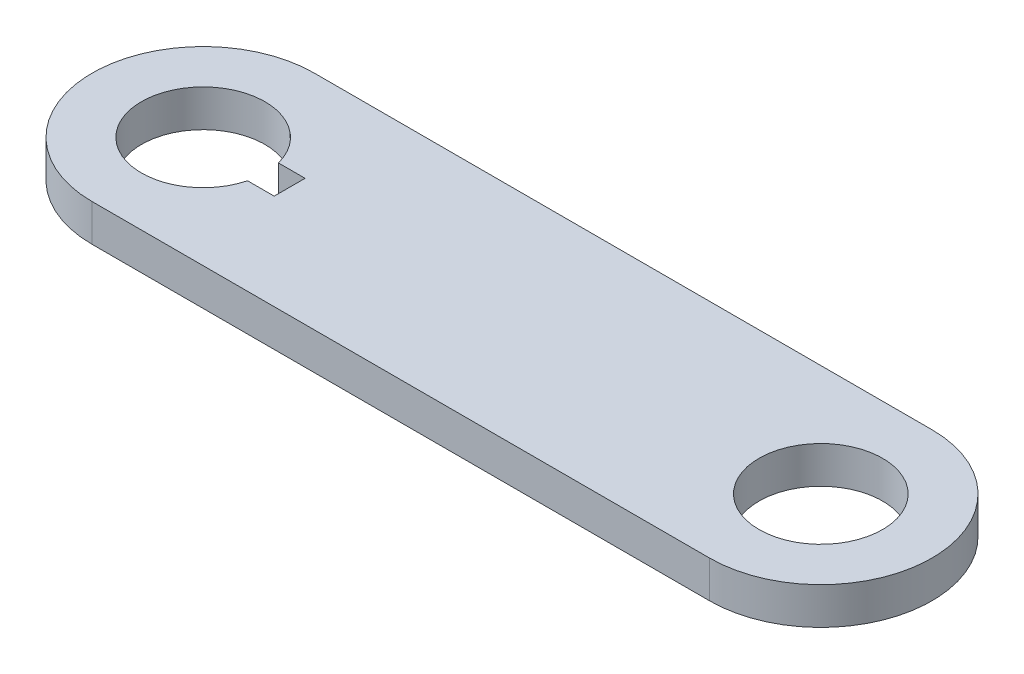
ISO-10303-21;
HEADER;
FILE_DESCRIPTION(('STEP AP214'),'2;1');
FILE_NAME('part.step','',(''),(''),'','','');
FILE_SCHEMA(('AUTOMOTIVE_DESIGN { 1 0 10303 214 1 1 1 1 }'));
ENDSEC;
DATA;
#1=APPLICATION_CONTEXT('core data for automotive mechanical design processes');
#2=APPLICATION_PROTOCOL_DEFINITION('international standard','automotive_design',2000,#1);
#3=PRODUCT_CONTEXT('',#1,'mechanical');
#4=PRODUCT('Part','Part','',(#3));
#5=PRODUCT_RELATED_PRODUCT_CATEGORY('part','',(#4));
#6=PRODUCT_DEFINITION_FORMATION('','',#4);
#7=PRODUCT_DEFINITION_CONTEXT('part definition',#1,'design');
#8=PRODUCT_DEFINITION('design','',#6,#7);
#9=PRODUCT_DEFINITION_SHAPE('','',#8);
#10=(LENGTH_UNIT() NAMED_UNIT(*) SI_UNIT(.MILLI.,.METRE.));
#11=(NAMED_UNIT(*) PLANE_ANGLE_UNIT() SI_UNIT($,.RADIAN.));
#12=(NAMED_UNIT(*) SI_UNIT($,.STERADIAN.) SOLID_ANGLE_UNIT());
#13=UNCERTAINTY_MEASURE_WITH_UNIT(LENGTH_MEASURE(1.E-05),#10,'distance_accuracy_value','');
#14=(GEOMETRIC_REPRESENTATION_CONTEXT(3) GLOBAL_UNCERTAINTY_ASSIGNED_CONTEXT((#13)) GLOBAL_UNIT_ASSIGNED_CONTEXT((#10,
#11,#12)) REPRESENTATION_CONTEXT('',''));
#15=CARTESIAN_POINT('',(0.,0.,0.));
#16=DIRECTION('',(0.,0.,1.));
#17=DIRECTION('',(1.,0.,0.));
#18=AXIS2_PLACEMENT_3D('',#15,#16,#17);
#19=CARTESIAN_POINT('',(0.,1.5,9.));
#20=DIRECTION('',(0.,0.,-1.));
#21=DIRECTION('',(-1.,0.,0.));
#22=AXIS2_PLACEMENT_3D('',#19,#20,#21);
#23=PLANE('',#22);
#24=DIRECTION('',(1.,0.,0.));
#25=VECTOR('',#24,1.);
#26=CARTESIAN_POINT('',(0.,-1.5,9.));
#27=LINE('',#26,#25);
#28=CARTESIAN_POINT('',(0.,-1.5,9.));
#29=VERTEX_POINT('',#28);
#30=CARTESIAN_POINT('',(50.,-1.5,9.));
#31=VERTEX_POINT('',#30);
#32=EDGE_CURVE('E166',#29,#31,#27,.T.);
#33=ORIENTED_EDGE('',*,*,#32,.T.);
#34=DIRECTION('',(0.,-1.,0.));
#35=VECTOR('',#34,1.);
#36=CARTESIAN_POINT('',(50.,1.5,9.));
#37=LINE('',#36,#35);
#38=CARTESIAN_POINT('',(50.,1.5,9.));
#39=VERTEX_POINT('',#38);
#40=EDGE_CURVE('E11',#39,#31,#37,.T.);
#41=ORIENTED_EDGE('',*,*,#40,.F.);
#42=DIRECTION('',(1.,0.,0.));
#43=VECTOR('',#42,1.);
#44=CARTESIAN_POINT('',(0.,1.5,9.));
#45=LINE('',#44,#43);
#46=CARTESIAN_POINT('',(0.,1.5,9.));
#47=VERTEX_POINT('',#46);
#48=EDGE_CURVE('E125',#47,#39,#45,.T.);
#49=ORIENTED_EDGE('',*,*,#48,.F.);
#50=DIRECTION('',(0.,-1.,0.));
#51=VECTOR('',#50,1.);
#52=CARTESIAN_POINT('',(0.,1.5,9.));
#53=LINE('',#52,#51);
#54=EDGE_CURVE('E178',#47,#29,#53,.T.);
#55=ORIENTED_EDGE('',*,*,#54,.T.);
#56=EDGE_LOOP('',(#33,#41,#49,#55));
#57=FACE_BOUND('',#56,.T.);
#58=ADVANCED_FACE('F47',(#57),#23,.F.);
#59=CARTESIAN_POINT('',(50.,1.5,0.));
#60=DIRECTION('',(0.,-1.,0.));
#61=DIRECTION('',(0.,0.,-1.));
#62=AXIS2_PLACEMENT_3D('',#59,#60,#61);
#63=CYLINDRICAL_SURFACE('',#62,9.);
#64=CARTESIAN_POINT('',(50.,-1.5,0.));
#65=DIRECTION('',(0.,1.,0.));
#66=DIRECTION('',(0.,0.,1.));
#67=AXIS2_PLACEMENT_3D('',#64,#65,#66);
#68=CIRCLE('',#67,9.);
#69=CARTESIAN_POINT('',(50.,-1.5,-9.));
#70=VERTEX_POINT('',#69);
#71=EDGE_CURVE('E132',#31,#70,#68,.T.);
#72=ORIENTED_EDGE('',*,*,#71,.T.);
#73=DIRECTION('',(0.,-1.,0.));
#74=VECTOR('',#73,1.);
#75=CARTESIAN_POINT('',(50.,1.5,-9.));
#76=LINE('',#75,#74);
#77=CARTESIAN_POINT('',(50.,1.5,-9.));
#78=VERTEX_POINT('',#77);
#79=EDGE_CURVE('E58',#78,#70,#76,.T.);
#80=ORIENTED_EDGE('',*,*,#79,.F.);
#81=CARTESIAN_POINT('',(50.,1.5,0.));
#82=DIRECTION('',(0.,1.,0.));
#83=DIRECTION('',(0.,0.,1.));
#84=AXIS2_PLACEMENT_3D('',#81,#82,#83);
#85=CIRCLE('',#84,9.);
#86=EDGE_CURVE('E119',#39,#78,#85,.T.);
#87=ORIENTED_EDGE('',*,*,#86,.F.);
#88=ORIENTED_EDGE('',*,*,#40,.T.);
#89=EDGE_LOOP('',(#72,#80,#87,#88));
#90=FACE_BOUND('',#89,.T.);
#91=ADVANCED_FACE('F131',(#90),#63,.T.);
#92=CARTESIAN_POINT('',(0.,1.5,-9.));
#93=DIRECTION('',(0.,0.,-1.));
#94=DIRECTION('',(-1.,0.,0.));
#95=AXIS2_PLACEMENT_3D('',#92,#93,#94);
#96=PLANE('',#95);
#97=DIRECTION('',(1.,0.,0.));
#98=VECTOR('',#97,1.);
#99=CARTESIAN_POINT('',(0.,-1.5,-9.));
#100=LINE('',#99,#98);
#101=CARTESIAN_POINT('',(0.,-1.5,-9.));
#102=VERTEX_POINT('',#101);
#103=EDGE_CURVE('E172',#102,#70,#100,.T.);
#104=ORIENTED_EDGE('',*,*,#103,.F.);
#105=DIRECTION('',(0.,-1.,0.));
#106=VECTOR('',#105,1.);
#107=CARTESIAN_POINT('',(0.,1.5,-9.));
#108=LINE('',#107,#106);
#109=CARTESIAN_POINT('',(0.,1.5,-9.));
#110=VERTEX_POINT('',#109);
#111=EDGE_CURVE('E95',#110,#102,#108,.T.);
#112=ORIENTED_EDGE('',*,*,#111,.F.);
#113=DIRECTION('',(1.,0.,0.));
#114=VECTOR('',#113,1.);
#115=CARTESIAN_POINT('',(0.,1.5,-9.));
#116=LINE('',#115,#114);
#117=EDGE_CURVE('E123',#110,#78,#116,.T.);
#118=ORIENTED_EDGE('',*,*,#117,.T.);
#119=ORIENTED_EDGE('',*,*,#79,.T.);
#120=EDGE_LOOP('',(#104,#112,#118,#119));
#121=FACE_BOUND('',#120,.T.);
#122=ADVANCED_FACE('F138',(#121),#96,.T.);
#123=CARTESIAN_POINT('',(0.,1.5,0.));
#124=DIRECTION('',(0.,-1.,0.));
#125=DIRECTION('',(0.,0.,-1.));
#126=AXIS2_PLACEMENT_3D('',#123,#124,#125);
#127=CYLINDRICAL_SURFACE('',#126,5.);
#128=CARTESIAN_POINT('',(0.,-1.5,0.));
#129=DIRECTION('',(0.,1.,0.));
#130=DIRECTION('',(0.,0.,1.));
#131=AXIS2_PLACEMENT_3D('',#128,#129,#130);
#132=CIRCLE('',#131,5.);
#133=CARTESIAN_POINT('',(4.84122918275927,-1.5,-1.25));
#134=VERTEX_POINT('',#133);
#135=CARTESIAN_POINT('',(4.84122918275927,-1.5,1.25));
#136=VERTEX_POINT('',#135);
#137=EDGE_CURVE('E150',#134,#136,#132,.T.);
#138=ORIENTED_EDGE('',*,*,#137,.F.);
#139=DIRECTION('',(0.,-1.,0.));
#140=VECTOR('',#139,1.);
#141=CARTESIAN_POINT('',(4.84122918275927,1.5,-1.25));
#142=LINE('',#141,#140);
#143=CARTESIAN_POINT('',(4.84122918275927,1.5,-1.25));
#144=VERTEX_POINT('',#143);
#145=EDGE_CURVE('E51',#144,#134,#142,.T.);
#146=ORIENTED_EDGE('',*,*,#145,.F.);
#147=CARTESIAN_POINT('',(0.,1.5,0.));
#148=DIRECTION('',(0.,1.,0.));
#149=DIRECTION('',(0.,0.,1.));
#150=AXIS2_PLACEMENT_3D('',#147,#148,#149);
#151=CIRCLE('',#150,5.);
#152=CARTESIAN_POINT('',(4.84122918275927,1.5,1.25));
#153=VERTEX_POINT('',#152);
#154=EDGE_CURVE('E204',#144,#153,#151,.T.);
#155=ORIENTED_EDGE('',*,*,#154,.T.);
#156=DIRECTION('',(0.,-1.,0.));
#157=VECTOR('',#156,1.);
#158=CARTESIAN_POINT('',(4.84122918275927,1.5,1.25));
#159=LINE('',#158,#157);
#160=EDGE_CURVE('E142',#153,#136,#159,.T.);
#161=ORIENTED_EDGE('',*,*,#160,.T.);
#162=EDGE_LOOP('',(#138,#146,#155,#161));
#163=FACE_BOUND('',#162,.T.);
#164=ADVANCED_FACE('F203',(#163),#127,.F.);
#165=CARTESIAN_POINT('',(0.,1.5,-1.25));
#166=DIRECTION('',(0.,0.,-1.));
#167=DIRECTION('',(-1.,0.,0.));
#168=AXIS2_PLACEMENT_3D('',#165,#166,#167);
#169=PLANE('',#168);
#170=DIRECTION('',(1.,0.,0.));
#171=VECTOR('',#170,1.);
#172=CARTESIAN_POINT('',(0.,-1.5,-1.25));
#173=LINE('',#172,#171);
#174=CARTESIAN_POINT('',(7.,-1.5,-1.25));
#175=VERTEX_POINT('',#174);
#176=EDGE_CURVE('E154',#134,#175,#173,.T.);
#177=ORIENTED_EDGE('',*,*,#176,.T.);
#178=DIRECTION('',(0.,-1.,0.));
#179=VECTOR('',#178,1.);
#180=CARTESIAN_POINT('',(7.,1.5,-1.25));
#181=LINE('',#180,#179);
#182=CARTESIAN_POINT('',(7.,1.5,-1.25));
#183=VERTEX_POINT('',#182);
#184=EDGE_CURVE('E187',#183,#175,#181,.T.);
#185=ORIENTED_EDGE('',*,*,#184,.F.);
#186=DIRECTION('',(1.,0.,0.));
#187=VECTOR('',#186,1.);
#188=CARTESIAN_POINT('',(0.,1.5,-1.25));
#189=LINE('',#188,#187);
#190=EDGE_CURVE('E197',#144,#183,#189,.T.);
#191=ORIENTED_EDGE('',*,*,#190,.F.);
#192=ORIENTED_EDGE('',*,*,#145,.T.);
#193=EDGE_LOOP('',(#177,#185,#191,#192));
#194=FACE_BOUND('',#193,.T.);
#195=ADVANCED_FACE('F195',(#194),#169,.F.);
#196=CARTESIAN_POINT('',(7.,1.5,0.));
#197=DIRECTION('',(1.,0.,0.));
#198=DIRECTION('',(0.,0.,-1.));
#199=AXIS2_PLACEMENT_3D('',#196,#197,#198);
#200=PLANE('',#199);
#201=DIRECTION('',(0.,0.,1.));
#202=VECTOR('',#201,1.);
#203=CARTESIAN_POINT('',(7.,-1.5,0.));
#204=LINE('',#203,#202);
#205=CARTESIAN_POINT('',(7.,-1.5,1.25));
#206=VERTEX_POINT('',#205);
#207=EDGE_CURVE('E158',#175,#206,#204,.T.);
#208=ORIENTED_EDGE('',*,*,#207,.T.);
#209=DIRECTION('',(0.,-1.,0.));
#210=VECTOR('',#209,1.);
#211=CARTESIAN_POINT('',(7.,1.5,1.25));
#212=LINE('',#211,#210);
#213=CARTESIAN_POINT('',(7.,1.5,1.25));
#214=VERTEX_POINT('',#213);
#215=EDGE_CURVE('E185',#214,#206,#212,.T.);
#216=ORIENTED_EDGE('',*,*,#215,.F.);
#217=DIRECTION('',(0.,0.,1.));
#218=VECTOR('',#217,1.);
#219=CARTESIAN_POINT('',(7.,1.5,0.));
#220=LINE('',#219,#218);
#221=EDGE_CURVE('E247',#183,#214,#220,.T.);
#222=ORIENTED_EDGE('',*,*,#221,.F.);
#223=ORIENTED_EDGE('',*,*,#184,.T.);
#224=EDGE_LOOP('',(#208,#216,#222,#223));
#225=FACE_BOUND('',#224,.T.);
#226=ADVANCED_FACE('F211',(#225),#200,.F.);
#227=CARTESIAN_POINT('',(0.,1.5,1.25));
#228=DIRECTION('',(0.,0.,-1.));
#229=DIRECTION('',(-1.,0.,0.));
#230=AXIS2_PLACEMENT_3D('',#227,#228,#229);
#231=PLANE('',#230);
#232=DIRECTION('',(1.,0.,0.));
#233=VECTOR('',#232,1.);
#234=CARTESIAN_POINT('',(0.,-1.5,1.25));
#235=LINE('',#234,#233);
#236=EDGE_CURVE('E162',#136,#206,#235,.T.);
#237=ORIENTED_EDGE('',*,*,#236,.F.);
#238=ORIENTED_EDGE('',*,*,#160,.F.);
#239=DIRECTION('',(1.,0.,0.));
#240=VECTOR('',#239,1.);
#241=CARTESIAN_POINT('',(0.,1.5,1.25));
#242=LINE('',#241,#240);
#243=EDGE_CURVE('E209',#153,#214,#242,.T.);
#244=ORIENTED_EDGE('',*,*,#243,.T.);
#245=ORIENTED_EDGE('',*,*,#215,.T.);
#246=EDGE_LOOP('',(#237,#238,#244,#245));
#247=FACE_BOUND('',#246,.T.);
#248=ADVANCED_FACE('F208',(#247),#231,.T.);
#249=CARTESIAN_POINT('',(50.,1.5,0.));
#250=DIRECTION('',(0.,-1.,0.));
#251=DIRECTION('',(0.,0.,-1.));
#252=AXIS2_PLACEMENT_3D('',#249,#250,#251);
#253=CYLINDRICAL_SURFACE('',#252,5.);
#254=CARTESIAN_POINT('',(50.,1.5,0.));
#255=DIRECTION('',(0.,1.,0.));
#256=DIRECTION('',(0.,0.,1.));
#257=AXIS2_PLACEMENT_3D('',#254,#255,#256);
#258=CIRCLE('',#257,5.);
#259=CARTESIAN_POINT('',(50.,1.5,5.));
#260=VERTEX_POINT('',#259);
#261=EDGE_CURVE('E177',#260,#260,#258,.T.);
#262=ORIENTED_EDGE('',*,*,#261,.T.);
#263=EDGE_LOOP('',(#262));
#264=FACE_BOUND('',#263,.T.);
#265=CARTESIAN_POINT('',(50.,-1.5,0.));
#266=DIRECTION('',(0.,1.,0.));
#267=DIRECTION('',(0.,0.,1.));
#268=AXIS2_PLACEMENT_3D('',#265,#266,#267);
#269=CIRCLE('',#268,5.);
#270=CARTESIAN_POINT('',(50.,-1.5,5.));
#271=VERTEX_POINT('',#270);
#272=EDGE_CURVE('E146',#271,#271,#269,.T.);
#273=ORIENTED_EDGE('',*,*,#272,.F.);
#274=EDGE_LOOP('',(#273));
#275=FACE_BOUND('',#274,.T.);
#276=ADVANCED_FACE('F49',(#264,#275),#253,.F.);
#277=CARTESIAN_POINT('',(0.,1.5,0.));
#278=DIRECTION('',(0.,-1.,0.));
#279=DIRECTION('',(0.,0.,-1.));
#280=AXIS2_PLACEMENT_3D('',#277,#278,#279);
#281=CYLINDRICAL_SURFACE('',#280,9.);
#282=CARTESIAN_POINT('',(0.,-1.5,0.));
#283=DIRECTION('',(0.,1.,0.));
#284=DIRECTION('',(0.,0.,1.));
#285=AXIS2_PLACEMENT_3D('',#282,#283,#284);
#286=CIRCLE('',#285,9.);
#287=EDGE_CURVE('E98',#102,#29,#286,.T.);
#288=ORIENTED_EDGE('',*,*,#287,.T.);
#289=ORIENTED_EDGE('',*,*,#54,.F.);
#290=CARTESIAN_POINT('',(0.,1.5,0.));
#291=DIRECTION('',(0.,1.,0.));
#292=DIRECTION('',(0.,0.,1.));
#293=AXIS2_PLACEMENT_3D('',#290,#291,#292);
#294=CIRCLE('',#293,9.);
#295=EDGE_CURVE('E67',#110,#47,#294,.T.);
#296=ORIENTED_EDGE('',*,*,#295,.F.);
#297=ORIENTED_EDGE('',*,*,#111,.T.);
#298=EDGE_LOOP('',(#288,#289,#296,#297));
#299=FACE_BOUND('',#298,.T.);
#300=ADVANCED_FACE('F230',(#299),#281,.T.);
#301=CARTESIAN_POINT('',(0.,1.5,0.));
#302=DIRECTION('',(0.,1.,0.));
#303=DIRECTION('',(0.,0.,1.));
#304=AXIS2_PLACEMENT_3D('',#301,#302,#303);
#305=PLANE('',#304);
#306=ORIENTED_EDGE('',*,*,#261,.F.);
#307=EDGE_LOOP('',(#306));
#308=FACE_BOUND('',#307,.T.);
#309=ORIENTED_EDGE('',*,*,#154,.F.);
#310=ORIENTED_EDGE('',*,*,#190,.T.);
#311=ORIENTED_EDGE('',*,*,#221,.T.);
#312=ORIENTED_EDGE('',*,*,#243,.F.);
#313=EDGE_LOOP('',(#309,#310,#311,#312));
#314=FACE_BOUND('',#313,.T.);
#315=ORIENTED_EDGE('',*,*,#48,.T.);
#316=ORIENTED_EDGE('',*,*,#86,.T.);
#317=ORIENTED_EDGE('',*,*,#117,.F.);
#318=ORIENTED_EDGE('',*,*,#295,.T.);
#319=EDGE_LOOP('',(#315,#316,#317,#318));
#320=FACE_BOUND('',#319,.T.);
#321=ADVANCED_FACE('F121',(#308,#314,#320),#305,.T.);
#322=CARTESIAN_POINT('',(0.,-1.5,0.));
#323=DIRECTION('',(0.,1.,0.));
#324=DIRECTION('',(0.,0.,1.));
#325=AXIS2_PLACEMENT_3D('',#322,#323,#324);
#326=PLANE('',#325);
#327=ORIENTED_EDGE('',*,*,#272,.T.);
#328=EDGE_LOOP('',(#327));
#329=FACE_BOUND('',#328,.T.);
#330=ORIENTED_EDGE('',*,*,#137,.T.);
#331=ORIENTED_EDGE('',*,*,#236,.T.);
#332=ORIENTED_EDGE('',*,*,#207,.F.);
#333=ORIENTED_EDGE('',*,*,#176,.F.);
#334=EDGE_LOOP('',(#330,#331,#332,#333));
#335=FACE_BOUND('',#334,.T.);
#336=ORIENTED_EDGE('',*,*,#32,.F.);
#337=ORIENTED_EDGE('',*,*,#287,.F.);
#338=ORIENTED_EDGE('',*,*,#103,.T.);
#339=ORIENTED_EDGE('',*,*,#71,.F.);
#340=EDGE_LOOP('',(#336,#337,#338,#339));
#341=FACE_BOUND('',#340,.T.);
#342=ADVANCED_FACE('F200',(#329,#335,#341),#326,.F.);
#343=CLOSED_SHELL('',(#58,#91,#122,#164,#195,#226,#248,#276,#300,#321,#342));
#344=MANIFOLD_SOLID_BREP('B2',#343);
#345=ADVANCED_BREP_SHAPE_REPRESENTATION('',(#18,#344),#14);
#346=SHAPE_DEFINITION_REPRESENTATION(#9,#345);
ENDSEC;
END-ISO-10303-21;
